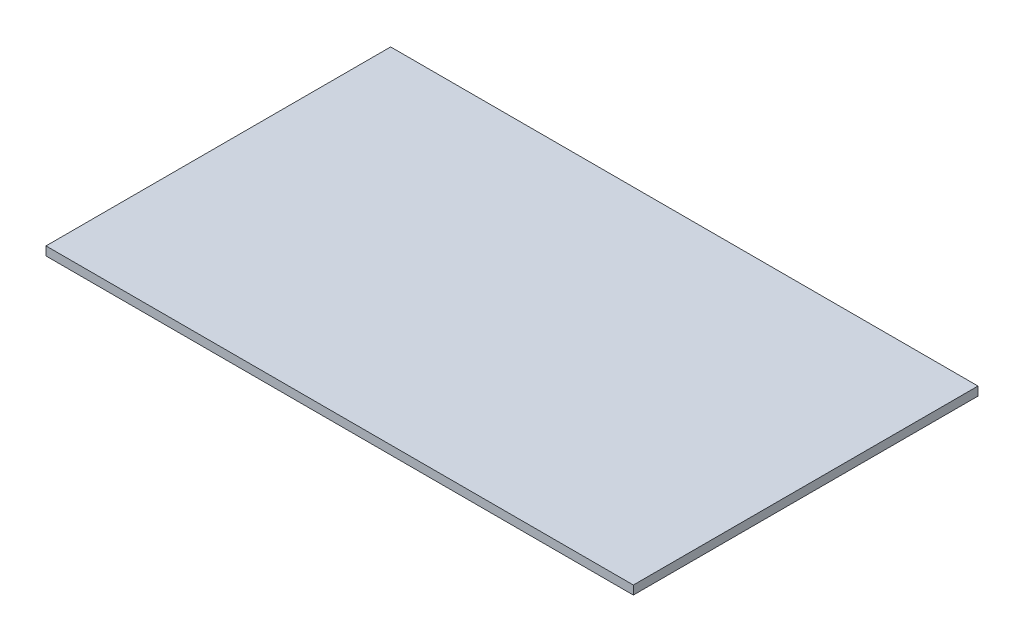
ISO-10303-21;
HEADER;
FILE_DESCRIPTION(('STEP AP214'),'2;1');
FILE_NAME('part.step','',(''),(''),'','','');
FILE_SCHEMA(('AUTOMOTIVE_DESIGN { 1 0 10303 214 1 1 1 1 }'));
ENDSEC;
DATA;
#1=APPLICATION_CONTEXT('core data for automotive mechanical design processes');
#2=APPLICATION_PROTOCOL_DEFINITION('international standard','automotive_design',2000,#1);
#3=PRODUCT_CONTEXT('',#1,'mechanical');
#4=PRODUCT('Part','Part','',(#3));
#5=PRODUCT_RELATED_PRODUCT_CATEGORY('part','',(#4));
#6=PRODUCT_DEFINITION_FORMATION('','',#4);
#7=PRODUCT_DEFINITION_CONTEXT('part definition',#1,'design');
#8=PRODUCT_DEFINITION('design','',#6,#7);
#9=PRODUCT_DEFINITION_SHAPE('','',#8);
#10=(LENGTH_UNIT() NAMED_UNIT(*) SI_UNIT(.MILLI.,.METRE.));
#11=(NAMED_UNIT(*) PLANE_ANGLE_UNIT() SI_UNIT($,.RADIAN.));
#12=(NAMED_UNIT(*) SI_UNIT($,.STERADIAN.) SOLID_ANGLE_UNIT());
#13=UNCERTAINTY_MEASURE_WITH_UNIT(LENGTH_MEASURE(1.E-05),#10,'distance_accuracy_value','');
#14=(GEOMETRIC_REPRESENTATION_CONTEXT(3) GLOBAL_UNCERTAINTY_ASSIGNED_CONTEXT((#13)) GLOBAL_UNIT_ASSIGNED_CONTEXT((#10,
#11,#12)) REPRESENTATION_CONTEXT('',''));
#15=CARTESIAN_POINT('',(0.,0.,0.));
#16=DIRECTION('',(0.,0.,1.));
#17=DIRECTION('',(1.,0.,0.));
#18=AXIS2_PLACEMENT_3D('',#15,#16,#17);
#19=CARTESIAN_POINT('',(-605.,18.,-355.));
#20=DIRECTION('',(0.,0.,-1.));
#21=DIRECTION('',(-1.,0.,0.));
#22=AXIS2_PLACEMENT_3D('',#19,#20,#21);
#23=PLANE('',#22);
#24=DIRECTION('',(1.,0.,0.));
#25=VECTOR('',#24,1.);
#26=CARTESIAN_POINT('',(-605.,0.,-355.));
#27=LINE('',#26,#25);
#28=CARTESIAN_POINT('',(-605.,0.,-355.));
#29=VERTEX_POINT('',#28);
#30=CARTESIAN_POINT('',(605.,0.,-355.));
#31=VERTEX_POINT('',#30);
#32=EDGE_CURVE('E98',#29,#31,#27,.T.);
#33=ORIENTED_EDGE('',*,*,#32,.F.);
#34=DIRECTION('',(0.,-1.,0.));
#35=VECTOR('',#34,1.);
#36=CARTESIAN_POINT('',(-605.,18.,-355.));
#37=LINE('',#36,#35);
#38=CARTESIAN_POINT('',(-605.,18.,-355.));
#39=VERTEX_POINT('',#38);
#40=EDGE_CURVE('E11',#39,#29,#37,.T.);
#41=ORIENTED_EDGE('',*,*,#40,.F.);
#42=DIRECTION('',(1.,0.,0.));
#43=VECTOR('',#42,1.);
#44=CARTESIAN_POINT('',(-605.,18.,-355.));
#45=LINE('',#44,#43);
#46=CARTESIAN_POINT('',(605.,18.,-355.));
#47=VERTEX_POINT('',#46);
#48=EDGE_CURVE('E93',#39,#47,#45,.T.);
#49=ORIENTED_EDGE('',*,*,#48,.T.);
#50=DIRECTION('',(0.,-1.,0.));
#51=VECTOR('',#50,1.);
#52=CARTESIAN_POINT('',(605.,18.,-355.));
#53=LINE('',#52,#51);
#54=EDGE_CURVE('E36',#47,#31,#53,.T.);
#55=ORIENTED_EDGE('',*,*,#54,.T.);
#56=EDGE_LOOP('',(#33,#41,#49,#55));
#57=FACE_BOUND('',#56,.T.);
#58=ADVANCED_FACE('F33',(#57),#23,.T.);
#59=CARTESIAN_POINT('',(-605.,18.,-355.));
#60=DIRECTION('',(1.,0.,0.));
#61=DIRECTION('',(0.,0.,-1.));
#62=AXIS2_PLACEMENT_3D('',#59,#60,#61);
#63=PLANE('',#62);
#64=DIRECTION('',(0.,0.,1.));
#65=VECTOR('',#64,1.);
#66=CARTESIAN_POINT('',(-605.,0.,-355.));
#67=LINE('',#66,#65);
#68=CARTESIAN_POINT('',(-605.,0.,355.));
#69=VERTEX_POINT('',#68);
#70=EDGE_CURVE('E66',#29,#69,#67,.T.);
#71=ORIENTED_EDGE('',*,*,#70,.T.);
#72=DIRECTION('',(0.,-1.,0.));
#73=VECTOR('',#72,1.);
#74=CARTESIAN_POINT('',(-605.,18.,355.));
#75=LINE('',#74,#73);
#76=CARTESIAN_POINT('',(-605.,18.,355.));
#77=VERTEX_POINT('',#76);
#78=EDGE_CURVE('E42',#77,#69,#75,.T.);
#79=ORIENTED_EDGE('',*,*,#78,.F.);
#80=DIRECTION('',(0.,0.,1.));
#81=VECTOR('',#80,1.);
#82=CARTESIAN_POINT('',(-605.,18.,-355.));
#83=LINE('',#82,#81);
#84=EDGE_CURVE('E83',#39,#77,#83,.T.);
#85=ORIENTED_EDGE('',*,*,#84,.F.);
#86=ORIENTED_EDGE('',*,*,#40,.T.);
#87=EDGE_LOOP('',(#71,#79,#85,#86));
#88=FACE_BOUND('',#87,.T.);
#89=ADVANCED_FACE('F108',(#88),#63,.F.);
#90=CARTESIAN_POINT('',(-605.,18.,355.));
#91=DIRECTION('',(0.,0.,-1.));
#92=DIRECTION('',(-1.,0.,0.));
#93=AXIS2_PLACEMENT_3D('',#90,#91,#92);
#94=PLANE('',#93);
#95=DIRECTION('',(1.,0.,0.));
#96=VECTOR('',#95,1.);
#97=CARTESIAN_POINT('',(-605.,0.,355.));
#98=LINE('',#97,#96);
#99=CARTESIAN_POINT('',(605.,0.,355.));
#100=VERTEX_POINT('',#99);
#101=EDGE_CURVE('E90',#69,#100,#98,.T.);
#102=ORIENTED_EDGE('',*,*,#101,.T.);
#103=DIRECTION('',(0.,-1.,0.));
#104=VECTOR('',#103,1.);
#105=CARTESIAN_POINT('',(605.,18.,355.));
#106=LINE('',#105,#104);
#107=CARTESIAN_POINT('',(605.,18.,355.));
#108=VERTEX_POINT('',#107);
#109=EDGE_CURVE('E87',#108,#100,#106,.T.);
#110=ORIENTED_EDGE('',*,*,#109,.F.);
#111=DIRECTION('',(1.,0.,0.));
#112=VECTOR('',#111,1.);
#113=CARTESIAN_POINT('',(-605.,18.,355.));
#114=LINE('',#113,#112);
#115=EDGE_CURVE('E78',#77,#108,#114,.T.);
#116=ORIENTED_EDGE('',*,*,#115,.F.);
#117=ORIENTED_EDGE('',*,*,#78,.T.);
#118=EDGE_LOOP('',(#102,#110,#116,#117));
#119=FACE_BOUND('',#118,.T.);
#120=ADVANCED_FACE('F88',(#119),#94,.F.);
#121=CARTESIAN_POINT('',(605.,18.,-355.));
#122=DIRECTION('',(1.,0.,0.));
#123=DIRECTION('',(0.,0.,-1.));
#124=AXIS2_PLACEMENT_3D('',#121,#122,#123);
#125=PLANE('',#124);
#126=DIRECTION('',(0.,0.,1.));
#127=VECTOR('',#126,1.);
#128=CARTESIAN_POINT('',(605.,0.,-355.));
#129=LINE('',#128,#127);
#130=EDGE_CURVE('E101',#31,#100,#129,.T.);
#131=ORIENTED_EDGE('',*,*,#130,.F.);
#132=ORIENTED_EDGE('',*,*,#54,.F.);
#133=DIRECTION('',(0.,0.,1.));
#134=VECTOR('',#133,1.);
#135=CARTESIAN_POINT('',(605.,18.,-355.));
#136=LINE('',#135,#134);
#137=EDGE_CURVE('E82',#47,#108,#136,.T.);
#138=ORIENTED_EDGE('',*,*,#137,.T.);
#139=ORIENTED_EDGE('',*,*,#109,.T.);
#140=EDGE_LOOP('',(#131,#132,#138,#139));
#141=FACE_BOUND('',#140,.T.);
#142=ADVANCED_FACE('F92',(#141),#125,.T.);
#143=CARTESIAN_POINT('',(0.,18.,0.));
#144=DIRECTION('',(0.,-1.,0.));
#145=DIRECTION('',(0.,0.,-1.));
#146=AXIS2_PLACEMENT_3D('',#143,#144,#145);
#147=PLANE('',#146);
#148=ORIENTED_EDGE('',*,*,#48,.F.);
#149=ORIENTED_EDGE('',*,*,#84,.T.);
#150=ORIENTED_EDGE('',*,*,#115,.T.);
#151=ORIENTED_EDGE('',*,*,#137,.F.);
#152=EDGE_LOOP('',(#148,#149,#150,#151));
#153=FACE_BOUND('',#152,.T.);
#154=ADVANCED_FACE('F81',(#153),#147,.F.);
#155=CARTESIAN_POINT('',(0.,0.,0.));
#156=DIRECTION('',(0.,-1.,0.));
#157=DIRECTION('',(0.,0.,-1.));
#158=AXIS2_PLACEMENT_3D('',#155,#156,#157);
#159=PLANE('',#158);
#160=ORIENTED_EDGE('',*,*,#32,.T.);
#161=ORIENTED_EDGE('',*,*,#130,.T.);
#162=ORIENTED_EDGE('',*,*,#101,.F.);
#163=ORIENTED_EDGE('',*,*,#70,.F.);
#164=EDGE_LOOP('',(#160,#161,#162,#163));
#165=FACE_BOUND('',#164,.T.);
#166=ADVANCED_FACE('F106',(#165),#159,.T.);
#167=CLOSED_SHELL('',(#58,#89,#120,#142,#154,#166));
#168=MANIFOLD_SOLID_BREP('B2',#167);
#169=ADVANCED_BREP_SHAPE_REPRESENTATION('',(#18,#168),#14);
#170=SHAPE_DEFINITION_REPRESENTATION(#9,#169);
ENDSEC;
END-ISO-10303-21;
